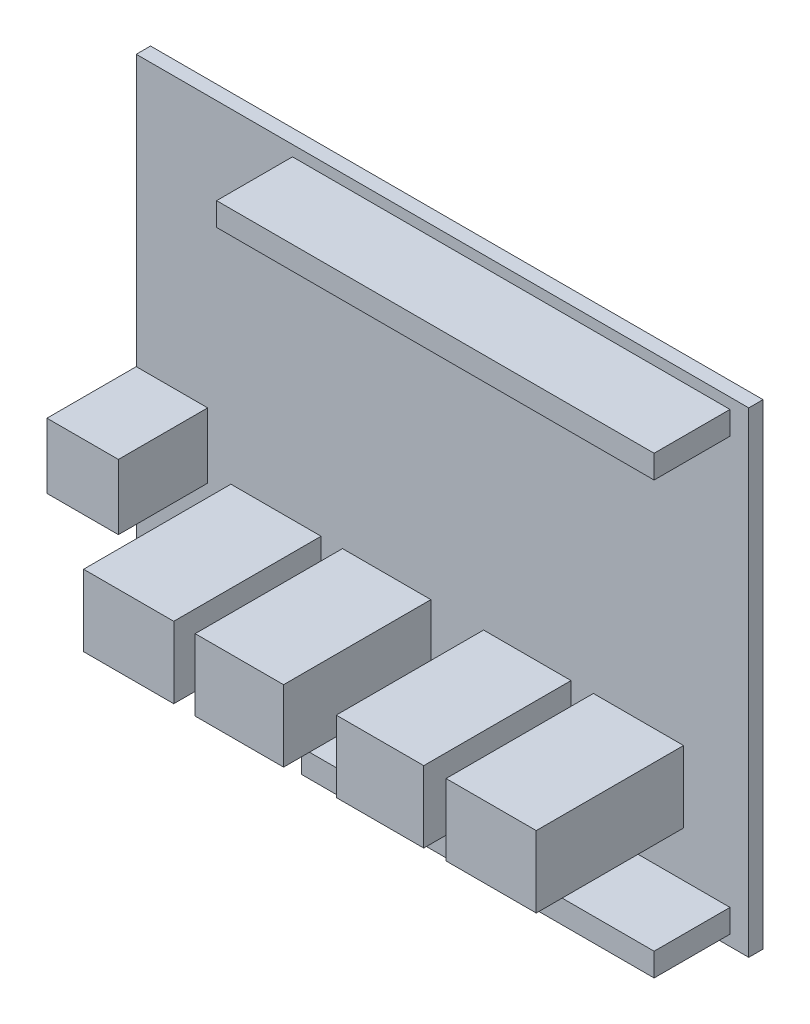
ISO-10303-21;
HEADER;
FILE_DESCRIPTION(('STEP AP214'),'2;1');
FILE_NAME('part.step','',(''),(''),'','','');
FILE_SCHEMA(('AUTOMOTIVE_DESIGN { 1 0 10303 214 1 1 1 1 }'));
ENDSEC;
DATA;
#1=APPLICATION_CONTEXT('core data for automotive mechanical design processes');
#2=APPLICATION_PROTOCOL_DEFINITION('international standard','automotive_design',2000,#1);
#3=PRODUCT_CONTEXT('',#1,'mechanical');
#4=PRODUCT('Part','Part','',(#3));
#5=PRODUCT_RELATED_PRODUCT_CATEGORY('part','',(#4));
#6=PRODUCT_DEFINITION_FORMATION('','',#4);
#7=PRODUCT_DEFINITION_CONTEXT('part definition',#1,'design');
#8=PRODUCT_DEFINITION('design','',#6,#7);
#9=PRODUCT_DEFINITION_SHAPE('','',#8);
#10=(LENGTH_UNIT() NAMED_UNIT(*) SI_UNIT(.MILLI.,.METRE.));
#11=(NAMED_UNIT(*) PLANE_ANGLE_UNIT() SI_UNIT($,.RADIAN.));
#12=(NAMED_UNIT(*) SI_UNIT($,.STERADIAN.) SOLID_ANGLE_UNIT());
#13=UNCERTAINTY_MEASURE_WITH_UNIT(LENGTH_MEASURE(1.E-05),#10,'distance_accuracy_value','');
#14=(GEOMETRIC_REPRESENTATION_CONTEXT(3) GLOBAL_UNCERTAINTY_ASSIGNED_CONTEXT((#13)) GLOBAL_UNIT_ASSIGNED_CONTEXT((#10,
#11,#12)) REPRESENTATION_CONTEXT('',''));
#15=CARTESIAN_POINT('',(0.,0.,0.));
#16=DIRECTION('',(0.,0.,1.));
#17=DIRECTION('',(1.,0.,0.));
#18=AXIS2_PLACEMENT_3D('',#15,#16,#17);
#19=CARTESIAN_POINT('',(0.,0.,1.6));
#20=DIRECTION('',(0.,0.,1.));
#21=DIRECTION('',(1.,0.,0.));
#22=AXIS2_PLACEMENT_3D('',#19,#20,#21);
#23=PLANE('',#22);
#24=DIRECTION('',(-1.,0.,0.));
#25=VECTOR('',#24,1.);
#26=CARTESIAN_POINT('',(0.,8.9,1.6));
#27=LINE('',#26,#25);
#28=CARTESIAN_POINT('',(61.3,8.9,1.60000000000001));
#29=VERTEX_POINT('',#28);
#30=CARTESIAN_POINT('',(51.2,8.9,1.60000000000001));
#31=VERTEX_POINT('',#30);
#32=EDGE_CURVE('E494',#29,#31,#27,.T.);
#33=ORIENTED_EDGE('',*,*,#32,.T.);
#34=DIRECTION('',(0.,1.,0.));
#35=VECTOR('',#34,1.);
#36=CARTESIAN_POINT('',(51.2,0.,1.6));
#37=LINE('',#36,#35);
#38=CARTESIAN_POINT('',(51.2,16.9,1.60000000000001));
#39=VERTEX_POINT('',#38);
#40=EDGE_CURVE('E496',#31,#39,#37,.T.);
#41=ORIENTED_EDGE('',*,*,#40,.T.);
#42=DIRECTION('',(1.,0.,0.));
#43=VECTOR('',#42,1.);
#44=CARTESIAN_POINT('',(0.,16.9,1.6));
#45=LINE('',#44,#43);
#46=CARTESIAN_POINT('',(61.3,16.9,1.6));
#47=VERTEX_POINT('',#46);
#48=EDGE_CURVE('E403',#39,#47,#45,.T.);
#49=ORIENTED_EDGE('',*,*,#48,.T.);
#50=DIRECTION('',(0.,-1.,0.));
#51=VECTOR('',#50,1.);
#52=CARTESIAN_POINT('',(61.3,0.,1.6));
#53=LINE('',#52,#51);
#54=EDGE_CURVE('E491',#47,#29,#53,.T.);
#55=ORIENTED_EDGE('',*,*,#54,.T.);
#56=EDGE_LOOP('',(#33,#41,#49,#55));
#57=FACE_BOUND('',#56,.T.);
#58=DIRECTION('',(-1.,0.,0.));
#59=VECTOR('',#58,1.);
#60=CARTESIAN_POINT('',(0.,8.9,1.6));
#61=LINE('',#60,#59);
#62=CARTESIAN_POINT('',(48.7,8.9,1.60000000000001));
#63=VERTEX_POINT('',#62);
#64=CARTESIAN_POINT('',(38.9,8.9,1.60000000000001));
#65=VERTEX_POINT('',#64);
#66=EDGE_CURVE('E512',#63,#65,#61,.T.);
#67=ORIENTED_EDGE('',*,*,#66,.T.);
#68=DIRECTION('',(0.,1.,0.));
#69=VECTOR('',#68,1.);
#70=CARTESIAN_POINT('',(38.9,0.,1.6));
#71=LINE('',#70,#69);
#72=CARTESIAN_POINT('',(38.9,16.9,1.60000000000001));
#73=VERTEX_POINT('',#72);
#74=EDGE_CURVE('E513',#65,#73,#71,.T.);
#75=ORIENTED_EDGE('',*,*,#74,.T.);
#76=DIRECTION('',(1.,0.,0.));
#77=VECTOR('',#76,1.);
#78=CARTESIAN_POINT('',(0.,16.9,1.6));
#79=LINE('',#78,#77);
#80=CARTESIAN_POINT('',(48.7,16.9,1.6));
#81=VERTEX_POINT('',#80);
#82=EDGE_CURVE('E504',#73,#81,#79,.T.);
#83=ORIENTED_EDGE('',*,*,#82,.T.);
#84=DIRECTION('',(0.,-1.,0.));
#85=VECTOR('',#84,1.);
#86=CARTESIAN_POINT('',(48.7,0.,1.6));
#87=LINE('',#86,#85);
#88=EDGE_CURVE('E510',#81,#63,#87,.T.);
#89=ORIENTED_EDGE('',*,*,#88,.T.);
#90=EDGE_LOOP('',(#67,#75,#83,#89));
#91=FACE_BOUND('',#90,.T.);
#92=DIRECTION('',(-1.,0.,0.));
#93=VECTOR('',#92,1.);
#94=CARTESIAN_POINT('',(0.,8.9,1.6));
#95=LINE('',#94,#93);
#96=CARTESIAN_POINT('',(33.,8.9,1.60000000000001));
#97=VERTEX_POINT('',#96);
#98=CARTESIAN_POINT('',(23.1,8.9,1.60000000000001));
#99=VERTEX_POINT('',#98);
#100=EDGE_CURVE('E527',#97,#99,#95,.T.);
#101=ORIENTED_EDGE('',*,*,#100,.T.);
#102=DIRECTION('',(0.,1.,0.));
#103=VECTOR('',#102,1.);
#104=CARTESIAN_POINT('',(23.1,0.,1.6));
#105=LINE('',#104,#103);
#106=CARTESIAN_POINT('',(23.1,16.9,1.60000000000001));
#107=VERTEX_POINT('',#106);
#108=EDGE_CURVE('E533',#99,#107,#105,.T.);
#109=ORIENTED_EDGE('',*,*,#108,.T.);
#110=DIRECTION('',(1.,0.,0.));
#111=VECTOR('',#110,1.);
#112=CARTESIAN_POINT('',(0.,16.9,1.6));
#113=LINE('',#112,#111);
#114=CARTESIAN_POINT('',(33.,16.9,1.6));
#115=VERTEX_POINT('',#114);
#116=EDGE_CURVE('E516',#107,#115,#113,.T.);
#117=ORIENTED_EDGE('',*,*,#116,.T.);
#118=DIRECTION('',(0.,-1.,0.));
#119=VECTOR('',#118,1.);
#120=CARTESIAN_POINT('',(33.,0.,1.6));
#121=LINE('',#120,#119);
#122=EDGE_CURVE('E521',#115,#97,#121,.T.);
#123=ORIENTED_EDGE('',*,*,#122,.T.);
#124=EDGE_LOOP('',(#101,#109,#117,#123));
#125=FACE_BOUND('',#124,.T.);
#126=DIRECTION('',(-1.,0.,0.));
#127=VECTOR('',#126,1.);
#128=CARTESIAN_POINT('',(0.,8.9,1.6));
#129=LINE('',#128,#127);
#130=CARTESIAN_POINT('',(20.7,8.9,1.60000000000001));
#131=VERTEX_POINT('',#130);
#132=CARTESIAN_POINT('',(10.6,8.9,1.60000000000001));
#133=VERTEX_POINT('',#132);
#134=EDGE_CURVE('E543',#131,#133,#129,.T.);
#135=ORIENTED_EDGE('',*,*,#134,.T.);
#136=DIRECTION('',(0.,1.,0.));
#137=VECTOR('',#136,1.);
#138=CARTESIAN_POINT('',(10.6,0.,1.6));
#139=LINE('',#138,#137);
#140=CARTESIAN_POINT('',(10.6,16.9,1.60000000000001));
#141=VERTEX_POINT('',#140);
#142=EDGE_CURVE('E550',#133,#141,#139,.T.);
#143=ORIENTED_EDGE('',*,*,#142,.T.);
#144=DIRECTION('',(1.,0.,0.));
#145=VECTOR('',#144,1.);
#146=CARTESIAN_POINT('',(0.,16.9,1.6));
#147=LINE('',#146,#145);
#148=CARTESIAN_POINT('',(20.7,16.9,1.6));
#149=VERTEX_POINT('',#148);
#150=EDGE_CURVE('E532',#141,#149,#147,.T.);
#151=ORIENTED_EDGE('',*,*,#150,.T.);
#152=DIRECTION('',(0.,-1.,0.));
#153=VECTOR('',#152,1.);
#154=CARTESIAN_POINT('',(20.7,0.,1.6));
#155=LINE('',#154,#153);
#156=EDGE_CURVE('E537',#149,#131,#155,.T.);
#157=ORIENTED_EDGE('',*,*,#156,.T.);
#158=EDGE_LOOP('',(#135,#143,#151,#157));
#159=FACE_BOUND('',#158,.T.);
#160=DIRECTION('',(0.,-1.,0.));
#161=VECTOR('',#160,1.);
#162=CARTESIAN_POINT('',(8.,0.,1.6));
#163=LINE('',#162,#161);
#164=CARTESIAN_POINT('',(8.,23.,1.6));
#165=VERTEX_POINT('',#164);
#166=CARTESIAN_POINT('',(8.,15.7,1.6));
#167=VERTEX_POINT('',#166);
#168=EDGE_CURVE('E371',#165,#167,#163,.T.);
#169=ORIENTED_EDGE('',*,*,#168,.T.);
#170=DIRECTION('',(-1.,0.,0.));
#171=VECTOR('',#170,1.);
#172=CARTESIAN_POINT('',(0.,15.7,1.6));
#173=LINE('',#172,#171);
#174=CARTESIAN_POINT('',(0.,15.7,1.6));
#175=VERTEX_POINT('',#174);
#176=EDGE_CURVE('E11',#167,#175,#173,.T.);
#177=ORIENTED_EDGE('',*,*,#176,.T.);
#178=DIRECTION('',(0.,-1.,0.));
#179=VECTOR('',#178,1.);
#180=CARTESIAN_POINT('',(0.,53.3,1.6));
#181=LINE('',#180,#179);
#182=CARTESIAN_POINT('',(0.,0.,1.6));
#183=VERTEX_POINT('',#182);
#184=EDGE_CURVE('E560',#175,#183,#181,.T.);
#185=ORIENTED_EDGE('',*,*,#184,.T.);
#186=DIRECTION('',(1.,0.,0.));
#187=VECTOR('',#186,1.);
#188=CARTESIAN_POINT('',(0.,0.,1.6));
#189=LINE('',#188,#187);
#190=CARTESIAN_POINT('',(68.6,0.,1.6));
#191=VERTEX_POINT('',#190);
#192=EDGE_CURVE('E557',#183,#191,#189,.T.);
#193=ORIENTED_EDGE('',*,*,#192,.T.);
#194=DIRECTION('',(0.,1.,0.));
#195=VECTOR('',#194,1.);
#196=CARTESIAN_POINT('',(68.6,0.,1.6));
#197=LINE('',#196,#195);
#198=CARTESIAN_POINT('',(68.6,53.3,1.6));
#199=VERTEX_POINT('',#198);
#200=EDGE_CURVE('E558',#191,#199,#197,.T.);
#201=ORIENTED_EDGE('',*,*,#200,.T.);
#202=DIRECTION('',(-1.,0.,0.));
#203=VECTOR('',#202,1.);
#204=CARTESIAN_POINT('',(68.6,53.3,1.6));
#205=LINE('',#204,#203);
#206=CARTESIAN_POINT('',(0.,53.3,1.6));
#207=VERTEX_POINT('',#206);
#208=EDGE_CURVE('E561',#199,#207,#205,.T.);
#209=ORIENTED_EDGE('',*,*,#208,.T.);
#210=CARTESIAN_POINT('',(0.,23.,1.6));
#211=VERTEX_POINT('',#210);
#212=EDGE_CURVE('E555',#207,#211,#181,.T.);
#213=ORIENTED_EDGE('',*,*,#212,.T.);
#214=DIRECTION('',(1.,0.,0.));
#215=VECTOR('',#214,1.);
#216=CARTESIAN_POINT('',(0.,23.,1.6));
#217=LINE('',#216,#215);
#218=EDGE_CURVE('E53',#211,#165,#217,.T.);
#219=ORIENTED_EDGE('',*,*,#218,.T.);
#220=EDGE_LOOP('',(#169,#177,#185,#193,#201,#209,#213,#219));
#221=FACE_BOUND('',#220,.T.);
#222=DIRECTION('',(-1.,0.,0.));
#223=VECTOR('',#222,1.);
#224=CARTESIAN_POINT('',(0.,1.2,1.6));
#225=LINE('',#224,#223);
#226=CARTESIAN_POINT('',(66.5,1.2,1.6));
#227=VERTEX_POINT('',#226);
#228=CARTESIAN_POINT('',(27.,1.2,1.6));
#229=VERTEX_POINT('',#228);
#230=EDGE_CURVE('E323',#227,#229,#225,.T.);
#231=ORIENTED_EDGE('',*,*,#230,.T.);
#232=DIRECTION('',(0.,1.,0.));
#233=VECTOR('',#232,1.);
#234=CARTESIAN_POINT('',(27.,0.,1.6));
#235=LINE('',#234,#233);
#236=CARTESIAN_POINT('',(27.,3.8,1.6));
#237=VERTEX_POINT('',#236);
#238=EDGE_CURVE('E330',#229,#237,#235,.T.);
#239=ORIENTED_EDGE('',*,*,#238,.T.);
#240=DIRECTION('',(1.,0.,0.));
#241=VECTOR('',#240,1.);
#242=CARTESIAN_POINT('',(0.,3.8,1.6));
#243=LINE('',#242,#241);
#244=CARTESIAN_POINT('',(66.5,3.8,1.6));
#245=VERTEX_POINT('',#244);
#246=EDGE_CURVE('E281',#237,#245,#243,.T.);
#247=ORIENTED_EDGE('',*,*,#246,.T.);
#248=DIRECTION('',(0.,-1.,0.));
#249=VECTOR('',#248,1.);
#250=CARTESIAN_POINT('',(66.5,0.,1.6));
#251=LINE('',#250,#249);
#252=EDGE_CURVE('E289',#245,#227,#251,.T.);
#253=ORIENTED_EDGE('',*,*,#252,.T.);
#254=EDGE_LOOP('',(#231,#239,#247,#253));
#255=FACE_BOUND('',#254,.T.);
#256=DIRECTION('',(-1.,0.,0.));
#257=VECTOR('',#256,1.);
#258=CARTESIAN_POINT('',(0.,49.5,1.6));
#259=LINE('',#258,#257);
#260=CARTESIAN_POINT('',(66.5,49.5,1.6));
#261=VERTEX_POINT('',#260);
#262=CARTESIAN_POINT('',(17.5,49.5,1.6));
#263=VERTEX_POINT('',#262);
#264=EDGE_CURVE('E336',#261,#263,#259,.T.);
#265=ORIENTED_EDGE('',*,*,#264,.T.);
#266=DIRECTION('',(0.,1.,0.));
#267=VECTOR('',#266,1.);
#268=CARTESIAN_POINT('',(17.5,0.,1.6));
#269=LINE('',#268,#267);
#270=CARTESIAN_POINT('',(17.5,52.1,1.6));
#271=VERTEX_POINT('',#270);
#272=EDGE_CURVE('E285',#263,#271,#269,.T.);
#273=ORIENTED_EDGE('',*,*,#272,.T.);
#274=DIRECTION('',(1.,0.,0.));
#275=VECTOR('',#274,1.);
#276=CARTESIAN_POINT('',(0.,52.1,1.6));
#277=LINE('',#276,#275);
#278=CARTESIAN_POINT('',(66.5,52.1,1.6));
#279=VERTEX_POINT('',#278);
#280=EDGE_CURVE('E332',#271,#279,#277,.T.);
#281=ORIENTED_EDGE('',*,*,#280,.T.);
#282=DIRECTION('',(0.,-1.,0.));
#283=VECTOR('',#282,1.);
#284=CARTESIAN_POINT('',(66.5,0.,1.6));
#285=LINE('',#284,#283);
#286=EDGE_CURVE('E333',#279,#261,#285,.T.);
#287=ORIENTED_EDGE('',*,*,#286,.T.);
#288=EDGE_LOOP('',(#265,#273,#281,#287));
#289=FACE_BOUND('',#288,.T.);
#290=ADVANCED_FACE('F44',(#57,#91,#125,#159,#221,#255,#289),#23,.T.);
#291=CARTESIAN_POINT('',(0.,53.3,1.6));
#292=DIRECTION('',(1.,0.,0.));
#293=DIRECTION('',(0.,0.,-1.));
#294=AXIS2_PLACEMENT_3D('',#291,#292,#293);
#295=PLANE('',#294);
#296=ORIENTED_EDGE('',*,*,#184,.F.);
#297=DIRECTION('',(0.,0.,-1.));
#298=VECTOR('',#297,1.);
#299=CARTESIAN_POINT('',(0.,15.7,11.6));
#300=LINE('',#299,#298);
#301=CARTESIAN_POINT('',(0.,15.7,11.6));
#302=VERTEX_POINT('',#301);
#303=EDGE_CURVE('E366',#302,#175,#300,.T.);
#304=ORIENTED_EDGE('',*,*,#303,.F.);
#305=DIRECTION('',(0.,-1.,0.));
#306=VECTOR('',#305,1.);
#307=CARTESIAN_POINT('',(0.,23.,11.6));
#308=LINE('',#307,#306);
#309=CARTESIAN_POINT('',(0.,23.,11.6));
#310=VERTEX_POINT('',#309);
#311=EDGE_CURVE('E344',#310,#302,#308,.T.);
#312=ORIENTED_EDGE('',*,*,#311,.F.);
#313=DIRECTION('',(0.,0.,-1.));
#314=VECTOR('',#313,1.);
#315=CARTESIAN_POINT('',(0.,23.,11.6));
#316=LINE('',#315,#314);
#317=EDGE_CURVE('E360',#310,#211,#316,.T.);
#318=ORIENTED_EDGE('',*,*,#317,.T.);
#319=ORIENTED_EDGE('',*,*,#212,.F.);
#320=DIRECTION('',(0.,0.,-1.));
#321=VECTOR('',#320,1.);
#322=CARTESIAN_POINT('',(0.,53.3,1.6));
#323=LINE('',#322,#321);
#324=CARTESIAN_POINT('',(0.,53.3,0.));
#325=VERTEX_POINT('',#324);
#326=EDGE_CURVE('E567',#207,#325,#323,.T.);
#327=ORIENTED_EDGE('',*,*,#326,.T.);
#328=DIRECTION('',(0.,-1.,0.));
#329=VECTOR('',#328,1.);
#330=CARTESIAN_POINT('',(0.,53.3,0.));
#331=LINE('',#330,#329);
#332=CARTESIAN_POINT('',(0.,0.,0.));
#333=VERTEX_POINT('',#332);
#334=EDGE_CURVE('E552',#325,#333,#331,.T.);
#335=ORIENTED_EDGE('',*,*,#334,.T.);
#336=DIRECTION('',(0.,0.,-1.));
#337=VECTOR('',#336,1.);
#338=CARTESIAN_POINT('',(0.,0.,1.6));
#339=LINE('',#338,#337);
#340=EDGE_CURVE('E589',#183,#333,#339,.T.);
#341=ORIENTED_EDGE('',*,*,#340,.F.);
#342=EDGE_LOOP('',(#296,#304,#312,#318,#319,#327,#335,#341));
#343=FACE_BOUND('',#342,.T.);
#344=ADVANCED_FACE('F50',(#343),#295,.F.);
#345=CARTESIAN_POINT('',(0.,0.,1.6));
#346=DIRECTION('',(0.,1.,0.));
#347=DIRECTION('',(0.,0.,1.));
#348=AXIS2_PLACEMENT_3D('',#345,#346,#347);
#349=PLANE('',#348);
#350=DIRECTION('',(1.,0.,0.));
#351=VECTOR('',#350,1.);
#352=CARTESIAN_POINT('',(0.,0.,0.));
#353=LINE('',#352,#351);
#354=CARTESIAN_POINT('',(68.6,0.,0.));
#355=VERTEX_POINT('',#354);
#356=EDGE_CURVE('E569',#333,#355,#353,.T.);
#357=ORIENTED_EDGE('',*,*,#356,.T.);
#358=DIRECTION('',(0.,0.,-1.));
#359=VECTOR('',#358,1.);
#360=CARTESIAN_POINT('',(68.6,0.,1.6));
#361=LINE('',#360,#359);
#362=EDGE_CURVE('E584',#191,#355,#361,.T.);
#363=ORIENTED_EDGE('',*,*,#362,.F.);
#364=ORIENTED_EDGE('',*,*,#192,.F.);
#365=ORIENTED_EDGE('',*,*,#340,.T.);
#366=EDGE_LOOP('',(#357,#363,#364,#365));
#367=FACE_BOUND('',#366,.T.);
#368=ADVANCED_FACE('F622',(#367),#349,.F.);
#369=CARTESIAN_POINT('',(68.6,0.,1.6));
#370=DIRECTION('',(-1.,0.,0.));
#371=DIRECTION('',(0.,0.,1.));
#372=AXIS2_PLACEMENT_3D('',#369,#370,#371);
#373=PLANE('',#372);
#374=DIRECTION('',(0.,1.,0.));
#375=VECTOR('',#374,1.);
#376=CARTESIAN_POINT('',(68.6,0.,0.));
#377=LINE('',#376,#375);
#378=CARTESIAN_POINT('',(68.6,53.3,0.));
#379=VERTEX_POINT('',#378);
#380=EDGE_CURVE('E575',#355,#379,#377,.T.);
#381=ORIENTED_EDGE('',*,*,#380,.T.);
#382=DIRECTION('',(0.,0.,-1.));
#383=VECTOR('',#382,1.);
#384=CARTESIAN_POINT('',(68.6,53.3,1.6));
#385=LINE('',#384,#383);
#386=EDGE_CURVE('E583',#199,#379,#385,.T.);
#387=ORIENTED_EDGE('',*,*,#386,.F.);
#388=ORIENTED_EDGE('',*,*,#200,.F.);
#389=ORIENTED_EDGE('',*,*,#362,.T.);
#390=EDGE_LOOP('',(#381,#387,#388,#389));
#391=FACE_BOUND('',#390,.T.);
#392=ADVANCED_FACE('F629',(#391),#373,.F.);
#393=CARTESIAN_POINT('',(68.6,53.3,1.6));
#394=DIRECTION('',(0.,-1.,0.));
#395=DIRECTION('',(0.,0.,-1.));
#396=AXIS2_PLACEMENT_3D('',#393,#394,#395);
#397=PLANE('',#396);
#398=DIRECTION('',(-1.,0.,0.));
#399=VECTOR('',#398,1.);
#400=CARTESIAN_POINT('',(68.6,53.3,0.));
#401=LINE('',#400,#399);
#402=EDGE_CURVE('E573',#379,#325,#401,.T.);
#403=ORIENTED_EDGE('',*,*,#402,.T.);
#404=ORIENTED_EDGE('',*,*,#326,.F.);
#405=ORIENTED_EDGE('',*,*,#208,.F.);
#406=ORIENTED_EDGE('',*,*,#386,.T.);
#407=EDGE_LOOP('',(#403,#404,#405,#406));
#408=FACE_BOUND('',#407,.T.);
#409=ADVANCED_FACE('F635',(#408),#397,.F.);
#410=CARTESIAN_POINT('',(0.,0.,0.));
#411=DIRECTION('',(0.,0.,1.));
#412=DIRECTION('',(1.,0.,0.));
#413=AXIS2_PLACEMENT_3D('',#410,#411,#412);
#414=PLANE('',#413);
#415=ORIENTED_EDGE('',*,*,#356,.F.);
#416=ORIENTED_EDGE('',*,*,#334,.F.);
#417=ORIENTED_EDGE('',*,*,#402,.F.);
#418=ORIENTED_EDGE('',*,*,#380,.F.);
#419=EDGE_LOOP('',(#415,#416,#417,#418));
#420=FACE_BOUND('',#419,.T.);
#421=ADVANCED_FACE('F634',(#420),#414,.F.);
#422=CARTESIAN_POINT('',(51.2,16.9,18.1));
#423=DIRECTION('',(1.,0.,0.));
#424=DIRECTION('',(0.,0.,-1.));
#425=AXIS2_PLACEMENT_3D('',#422,#423,#424);
#426=PLANE('',#425);
#427=ORIENTED_EDGE('',*,*,#40,.F.);
#428=DIRECTION('',(0.,0.,-1.));
#429=VECTOR('',#428,1.);
#430=CARTESIAN_POINT('',(51.2,8.9,18.1));
#431=LINE('',#430,#429);
#432=CARTESIAN_POINT('',(51.2,8.9,18.1));
#433=VERTEX_POINT('',#432);
#434=EDGE_CURVE('E374',#433,#31,#431,.T.);
#435=ORIENTED_EDGE('',*,*,#434,.F.);
#436=DIRECTION('',(0.,-1.,0.));
#437=VECTOR('',#436,1.);
#438=CARTESIAN_POINT('',(51.2,16.9,18.1));
#439=LINE('',#438,#437);
#440=CARTESIAN_POINT('',(51.2,16.9,18.1));
#441=VERTEX_POINT('',#440);
#442=EDGE_CURVE('E438',#441,#433,#439,.T.);
#443=ORIENTED_EDGE('',*,*,#442,.F.);
#444=DIRECTION('',(0.,0.,-1.));
#445=VECTOR('',#444,1.);
#446=CARTESIAN_POINT('',(51.2,16.9,18.1));
#447=LINE('',#446,#445);
#448=EDGE_CURVE('E472',#441,#39,#447,.T.);
#449=ORIENTED_EDGE('',*,*,#448,.T.);
#450=EDGE_LOOP('',(#427,#435,#443,#449));
#451=FACE_BOUND('',#450,.T.);
#452=ADVANCED_FACE('F638',(#451),#426,.F.);
#453=CARTESIAN_POINT('',(51.2,8.9,18.1));
#454=DIRECTION('',(0.,1.,0.));
#455=DIRECTION('',(0.,0.,1.));
#456=AXIS2_PLACEMENT_3D('',#453,#454,#455);
#457=PLANE('',#456);
#458=ORIENTED_EDGE('',*,*,#32,.F.);
#459=DIRECTION('',(0.,0.,-1.));
#460=VECTOR('',#459,1.);
#461=CARTESIAN_POINT('',(61.3,8.9,18.1));
#462=LINE('',#461,#460);
#463=CARTESIAN_POINT('',(61.3,8.9,18.1));
#464=VERTEX_POINT('',#463);
#465=EDGE_CURVE('E463',#464,#29,#462,.T.);
#466=ORIENTED_EDGE('',*,*,#465,.F.);
#467=DIRECTION('',(1.,0.,0.));
#468=VECTOR('',#467,1.);
#469=CARTESIAN_POINT('',(51.2,8.9,18.1));
#470=LINE('',#469,#468);
#471=EDGE_CURVE('E485',#433,#464,#470,.T.);
#472=ORIENTED_EDGE('',*,*,#471,.F.);
#473=ORIENTED_EDGE('',*,*,#434,.T.);
#474=EDGE_LOOP('',(#458,#466,#472,#473));
#475=FACE_BOUND('',#474,.T.);
#476=ADVANCED_FACE('F641',(#475),#457,.F.);
#477=CARTESIAN_POINT('',(61.3,8.9,18.1));
#478=DIRECTION('',(-1.,0.,0.));
#479=DIRECTION('',(0.,0.,1.));
#480=AXIS2_PLACEMENT_3D('',#477,#478,#479);
#481=PLANE('',#480);
#482=ORIENTED_EDGE('',*,*,#54,.F.);
#483=DIRECTION('',(0.,0.,-1.));
#484=VECTOR('',#483,1.);
#485=CARTESIAN_POINT('',(61.3,16.9,18.1));
#486=LINE('',#485,#484);
#487=CARTESIAN_POINT('',(61.3,16.9,18.1));
#488=VERTEX_POINT('',#487);
#489=EDGE_CURVE('E469',#488,#47,#486,.T.);
#490=ORIENTED_EDGE('',*,*,#489,.F.);
#491=DIRECTION('',(0.,1.,0.));
#492=VECTOR('',#491,1.);
#493=CARTESIAN_POINT('',(61.3,8.9,18.1));
#494=LINE('',#493,#492);
#495=EDGE_CURVE('E479',#464,#488,#494,.T.);
#496=ORIENTED_EDGE('',*,*,#495,.F.);
#497=ORIENTED_EDGE('',*,*,#465,.T.);
#498=EDGE_LOOP('',(#482,#490,#496,#497));
#499=FACE_BOUND('',#498,.T.);
#500=ADVANCED_FACE('F661',(#499),#481,.F.);
#501=CARTESIAN_POINT('',(61.3,16.9,18.1));
#502=DIRECTION('',(0.,-1.,0.));
#503=DIRECTION('',(0.,0.,-1.));
#504=AXIS2_PLACEMENT_3D('',#501,#502,#503);
#505=PLANE('',#504);
#506=ORIENTED_EDGE('',*,*,#48,.F.);
#507=ORIENTED_EDGE('',*,*,#448,.F.);
#508=DIRECTION('',(-1.,0.,0.));
#509=VECTOR('',#508,1.);
#510=CARTESIAN_POINT('',(61.3,16.9,18.1));
#511=LINE('',#510,#509);
#512=EDGE_CURVE('E478',#488,#441,#511,.T.);
#513=ORIENTED_EDGE('',*,*,#512,.F.);
#514=ORIENTED_EDGE('',*,*,#489,.T.);
#515=EDGE_LOOP('',(#506,#507,#513,#514));
#516=FACE_BOUND('',#515,.T.);
#517=ADVANCED_FACE('F659',(#516),#505,.F.);
#518=CARTESIAN_POINT('',(0.,0.,18.1));
#519=DIRECTION('',(0.,0.,1.));
#520=DIRECTION('',(1.,0.,0.));
#521=AXIS2_PLACEMENT_3D('',#518,#519,#520);
#522=PLANE('',#521);
#523=ORIENTED_EDGE('',*,*,#442,.T.);
#524=ORIENTED_EDGE('',*,*,#471,.T.);
#525=ORIENTED_EDGE('',*,*,#495,.T.);
#526=ORIENTED_EDGE('',*,*,#512,.T.);
#527=EDGE_LOOP('',(#523,#524,#525,#526));
#528=FACE_BOUND('',#527,.T.);
#529=ADVANCED_FACE('F656',(#528),#522,.T.);
#530=CARTESIAN_POINT('',(38.9,16.9,18.1));
#531=DIRECTION('',(1.,0.,0.));
#532=DIRECTION('',(0.,0.,-1.));
#533=AXIS2_PLACEMENT_3D('',#530,#531,#532);
#534=PLANE('',#533);
#535=ORIENTED_EDGE('',*,*,#74,.F.);
#536=DIRECTION('',(0.,0.,-1.));
#537=VECTOR('',#536,1.);
#538=CARTESIAN_POINT('',(38.9,8.9,18.1));
#539=LINE('',#538,#537);
#540=CARTESIAN_POINT('',(38.9,8.9,18.1));
#541=VERTEX_POINT('',#540);
#542=EDGE_CURVE('E432',#541,#65,#539,.T.);
#543=ORIENTED_EDGE('',*,*,#542,.F.);
#544=DIRECTION('',(0.,-1.,0.));
#545=VECTOR('',#544,1.);
#546=CARTESIAN_POINT('',(38.9,16.9,18.1));
#547=LINE('',#546,#545);
#548=CARTESIAN_POINT('',(38.9,16.9,18.1));
#549=VERTEX_POINT('',#548);
#550=EDGE_CURVE('E413',#549,#541,#547,.T.);
#551=ORIENTED_EDGE('',*,*,#550,.F.);
#552=DIRECTION('',(0.,0.,-1.));
#553=VECTOR('',#552,1.);
#554=CARTESIAN_POINT('',(38.9,16.9,18.1));
#555=LINE('',#554,#553);
#556=EDGE_CURVE('E447',#549,#73,#555,.T.);
#557=ORIENTED_EDGE('',*,*,#556,.T.);
#558=EDGE_LOOP('',(#535,#543,#551,#557));
#559=FACE_BOUND('',#558,.T.);
#560=ADVANCED_FACE('F658',(#559),#534,.F.);
#561=CARTESIAN_POINT('',(38.9,8.9,18.1));
#562=DIRECTION('',(0.,1.,0.));
#563=DIRECTION('',(0.,0.,1.));
#564=AXIS2_PLACEMENT_3D('',#561,#562,#563);
#565=PLANE('',#564);
#566=ORIENTED_EDGE('',*,*,#66,.F.);
#567=DIRECTION('',(0.,0.,-1.));
#568=VECTOR('',#567,1.);
#569=CARTESIAN_POINT('',(48.7,8.9,18.1));
#570=LINE('',#569,#568);
#571=CARTESIAN_POINT('',(48.7,8.9,18.1));
#572=VERTEX_POINT('',#571);
#573=EDGE_CURVE('E437',#572,#63,#570,.T.);
#574=ORIENTED_EDGE('',*,*,#573,.F.);
#575=DIRECTION('',(1.,0.,0.));
#576=VECTOR('',#575,1.);
#577=CARTESIAN_POINT('',(38.9,8.9,18.1));
#578=LINE('',#577,#576);
#579=EDGE_CURVE('E457',#541,#572,#578,.T.);
#580=ORIENTED_EDGE('',*,*,#579,.F.);
#581=ORIENTED_EDGE('',*,*,#542,.T.);
#582=EDGE_LOOP('',(#566,#574,#580,#581));
#583=FACE_BOUND('',#582,.T.);
#584=ADVANCED_FACE('F681',(#583),#565,.F.);
#585=CARTESIAN_POINT('',(48.7,8.9,18.1));
#586=DIRECTION('',(-1.,0.,0.));
#587=DIRECTION('',(0.,0.,1.));
#588=AXIS2_PLACEMENT_3D('',#585,#586,#587);
#589=PLANE('',#588);
#590=ORIENTED_EDGE('',*,*,#88,.F.);
#591=DIRECTION('',(0.,0.,-1.));
#592=VECTOR('',#591,1.);
#593=CARTESIAN_POINT('',(48.7,16.9,18.1));
#594=LINE('',#593,#592);
#595=CARTESIAN_POINT('',(48.7,16.9,18.1));
#596=VERTEX_POINT('',#595);
#597=EDGE_CURVE('E444',#596,#81,#594,.T.);
#598=ORIENTED_EDGE('',*,*,#597,.F.);
#599=DIRECTION('',(0.,1.,0.));
#600=VECTOR('',#599,1.);
#601=CARTESIAN_POINT('',(48.7,8.9,18.1));
#602=LINE('',#601,#600);
#603=EDGE_CURVE('E451',#572,#596,#602,.T.);
#604=ORIENTED_EDGE('',*,*,#603,.F.);
#605=ORIENTED_EDGE('',*,*,#573,.T.);
#606=EDGE_LOOP('',(#590,#598,#604,#605));
#607=FACE_BOUND('',#606,.T.);
#608=ADVANCED_FACE('F678',(#607),#589,.F.);
#609=CARTESIAN_POINT('',(48.7,16.9,18.1));
#610=DIRECTION('',(0.,-1.,0.));
#611=DIRECTION('',(0.,0.,-1.));
#612=AXIS2_PLACEMENT_3D('',#609,#610,#611);
#613=PLANE('',#612);
#614=ORIENTED_EDGE('',*,*,#82,.F.);
#615=ORIENTED_EDGE('',*,*,#556,.F.);
#616=DIRECTION('',(-1.,0.,0.));
#617=VECTOR('',#616,1.);
#618=CARTESIAN_POINT('',(48.7,16.9,18.1));
#619=LINE('',#618,#617);
#620=EDGE_CURVE('E448',#596,#549,#619,.T.);
#621=ORIENTED_EDGE('',*,*,#620,.F.);
#622=ORIENTED_EDGE('',*,*,#597,.T.);
#623=EDGE_LOOP('',(#614,#615,#621,#622));
#624=FACE_BOUND('',#623,.T.);
#625=ADVANCED_FACE('F677',(#624),#613,.F.);
#626=CARTESIAN_POINT('',(0.,0.,18.1));
#627=DIRECTION('',(0.,0.,1.));
#628=DIRECTION('',(1.,0.,0.));
#629=AXIS2_PLACEMENT_3D('',#626,#627,#628);
#630=PLANE('',#629);
#631=ORIENTED_EDGE('',*,*,#550,.T.);
#632=ORIENTED_EDGE('',*,*,#579,.T.);
#633=ORIENTED_EDGE('',*,*,#603,.T.);
#634=ORIENTED_EDGE('',*,*,#620,.T.);
#635=EDGE_LOOP('',(#631,#632,#633,#634));
#636=FACE_BOUND('',#635,.T.);
#637=ADVANCED_FACE('F675',(#636),#630,.T.);
#638=CARTESIAN_POINT('',(23.1,16.9,18.1));
#639=DIRECTION('',(1.,0.,0.));
#640=DIRECTION('',(0.,0.,-1.));
#641=AXIS2_PLACEMENT_3D('',#638,#639,#640);
#642=PLANE('',#641);
#643=ORIENTED_EDGE('',*,*,#108,.F.);
#644=DIRECTION('',(0.,0.,-1.));
#645=VECTOR('',#644,1.);
#646=CARTESIAN_POINT('',(23.1,8.9,18.1));
#647=LINE('',#646,#645);
#648=CARTESIAN_POINT('',(23.1,8.9,18.1));
#649=VERTEX_POINT('',#648);
#650=EDGE_CURVE('E407',#649,#99,#647,.T.);
#651=ORIENTED_EDGE('',*,*,#650,.F.);
#652=DIRECTION('',(0.,-1.,0.));
#653=VECTOR('',#652,1.);
#654=CARTESIAN_POINT('',(23.1,16.9,18.1));
#655=LINE('',#654,#653);
#656=CARTESIAN_POINT('',(23.1,16.9,18.1));
#657=VERTEX_POINT('',#656);
#658=EDGE_CURVE('E381',#657,#649,#655,.T.);
#659=ORIENTED_EDGE('',*,*,#658,.F.);
#660=DIRECTION('',(0.,0.,-1.));
#661=VECTOR('',#660,1.);
#662=CARTESIAN_POINT('',(23.1,16.9,18.1));
#663=LINE('',#662,#661);
#664=EDGE_CURVE('E416',#657,#107,#663,.T.);
#665=ORIENTED_EDGE('',*,*,#664,.T.);
#666=EDGE_LOOP('',(#643,#651,#659,#665));
#667=FACE_BOUND('',#666,.T.);
#668=ADVANCED_FACE('F672',(#667),#642,.F.);
#669=CARTESIAN_POINT('',(23.1,8.9,18.1));
#670=DIRECTION('',(0.,1.,0.));
#671=DIRECTION('',(0.,0.,1.));
#672=AXIS2_PLACEMENT_3D('',#669,#670,#671);
#673=PLANE('',#672);
#674=ORIENTED_EDGE('',*,*,#100,.F.);
#675=DIRECTION('',(0.,0.,-1.));
#676=VECTOR('',#675,1.);
#677=CARTESIAN_POINT('',(33.,8.9,18.1));
#678=LINE('',#677,#676);
#679=CARTESIAN_POINT('',(33.,8.9,18.1));
#680=VERTEX_POINT('',#679);
#681=EDGE_CURVE('E408',#680,#97,#678,.T.);
#682=ORIENTED_EDGE('',*,*,#681,.F.);
#683=DIRECTION('',(1.,0.,0.));
#684=VECTOR('',#683,1.);
#685=CARTESIAN_POINT('',(23.1,8.9,18.1));
#686=LINE('',#685,#684);
#687=EDGE_CURVE('E428',#649,#680,#686,.T.);
#688=ORIENTED_EDGE('',*,*,#687,.F.);
#689=ORIENTED_EDGE('',*,*,#650,.T.);
#690=EDGE_LOOP('',(#674,#682,#688,#689));
#691=FACE_BOUND('',#690,.T.);
#692=ADVANCED_FACE('F702',(#691),#673,.F.);
#693=CARTESIAN_POINT('',(33.,8.9,18.1));
#694=DIRECTION('',(-1.,0.,0.));
#695=DIRECTION('',(0.,0.,1.));
#696=AXIS2_PLACEMENT_3D('',#693,#694,#695);
#697=PLANE('',#696);
#698=ORIENTED_EDGE('',*,*,#122,.F.);
#699=DIRECTION('',(0.,0.,-1.));
#700=VECTOR('',#699,1.);
#701=CARTESIAN_POINT('',(33.,16.9,18.1));
#702=LINE('',#701,#700);
#703=CARTESIAN_POINT('',(33.,16.9,18.1));
#704=VERTEX_POINT('',#703);
#705=EDGE_CURVE('E412',#704,#115,#702,.T.);
#706=ORIENTED_EDGE('',*,*,#705,.F.);
#707=DIRECTION('',(0.,1.,0.));
#708=VECTOR('',#707,1.);
#709=CARTESIAN_POINT('',(33.,8.9,18.1));
#710=LINE('',#709,#708);
#711=EDGE_CURVE('E422',#680,#704,#710,.T.);
#712=ORIENTED_EDGE('',*,*,#711,.F.);
#713=ORIENTED_EDGE('',*,*,#681,.T.);
#714=EDGE_LOOP('',(#698,#706,#712,#713));
#715=FACE_BOUND('',#714,.T.);
#716=ADVANCED_FACE('F697',(#715),#697,.F.);
#717=CARTESIAN_POINT('',(33.,16.9,18.1));
#718=DIRECTION('',(0.,-1.,0.));
#719=DIRECTION('',(0.,0.,-1.));
#720=AXIS2_PLACEMENT_3D('',#717,#718,#719);
#721=PLANE('',#720);
#722=ORIENTED_EDGE('',*,*,#116,.F.);
#723=ORIENTED_EDGE('',*,*,#664,.F.);
#724=DIRECTION('',(-1.,0.,0.));
#725=VECTOR('',#724,1.);
#726=CARTESIAN_POINT('',(33.,16.9,18.1));
#727=LINE('',#726,#725);
#728=EDGE_CURVE('E425',#704,#657,#727,.T.);
#729=ORIENTED_EDGE('',*,*,#728,.F.);
#730=ORIENTED_EDGE('',*,*,#705,.T.);
#731=EDGE_LOOP('',(#722,#723,#729,#730));
#732=FACE_BOUND('',#731,.T.);
#733=ADVANCED_FACE('F698',(#732),#721,.F.);
#734=CARTESIAN_POINT('',(0.,0.,18.1));
#735=DIRECTION('',(0.,0.,1.));
#736=DIRECTION('',(1.,0.,0.));
#737=AXIS2_PLACEMENT_3D('',#734,#735,#736);
#738=PLANE('',#737);
#739=ORIENTED_EDGE('',*,*,#658,.T.);
#740=ORIENTED_EDGE('',*,*,#687,.T.);
#741=ORIENTED_EDGE('',*,*,#711,.T.);
#742=ORIENTED_EDGE('',*,*,#728,.T.);
#743=EDGE_LOOP('',(#739,#740,#741,#742));
#744=FACE_BOUND('',#743,.T.);
#745=ADVANCED_FACE('F692',(#744),#738,.T.);
#746=CARTESIAN_POINT('',(10.6,16.9,18.1));
#747=DIRECTION('',(1.,0.,0.));
#748=DIRECTION('',(0.,0.,-1.));
#749=AXIS2_PLACEMENT_3D('',#746,#747,#748);
#750=PLANE('',#749);
#751=ORIENTED_EDGE('',*,*,#142,.F.);
#752=DIRECTION('',(0.,0.,-1.));
#753=VECTOR('',#752,1.);
#754=CARTESIAN_POINT('',(10.6,8.9,18.1));
#755=LINE('',#754,#753);
#756=CARTESIAN_POINT('',(10.6,8.9,18.1));
#757=VERTEX_POINT('',#756);
#758=EDGE_CURVE('E402',#757,#133,#755,.T.);
#759=ORIENTED_EDGE('',*,*,#758,.F.);
#760=DIRECTION('',(0.,-1.,0.));
#761=VECTOR('',#760,1.);
#762=CARTESIAN_POINT('',(10.6,16.9,18.1));
#763=LINE('',#762,#761);
#764=CARTESIAN_POINT('',(10.6,16.9,18.1));
#765=VERTEX_POINT('',#764);
#766=EDGE_CURVE('E376',#765,#757,#763,.T.);
#767=ORIENTED_EDGE('',*,*,#766,.F.);
#768=DIRECTION('',(0.,0.,-1.));
#769=VECTOR('',#768,1.);
#770=CARTESIAN_POINT('',(10.6,16.9,18.1));
#771=LINE('',#770,#769);
#772=EDGE_CURVE('E388',#765,#141,#771,.T.);
#773=ORIENTED_EDGE('',*,*,#772,.T.);
#774=EDGE_LOOP('',(#751,#759,#767,#773));
#775=FACE_BOUND('',#774,.T.);
#776=ADVANCED_FACE('F694',(#775),#750,.F.);
#777=CARTESIAN_POINT('',(10.6,8.9,18.1));
#778=DIRECTION('',(0.,1.,0.));
#779=DIRECTION('',(0.,0.,1.));
#780=AXIS2_PLACEMENT_3D('',#777,#778,#779);
#781=PLANE('',#780);
#782=ORIENTED_EDGE('',*,*,#134,.F.);
#783=DIRECTION('',(0.,0.,-1.));
#784=VECTOR('',#783,1.);
#785=CARTESIAN_POINT('',(20.7,8.9,18.1));
#786=LINE('',#785,#784);
#787=CARTESIAN_POINT('',(20.7,8.9,18.1));
#788=VERTEX_POINT('',#787);
#789=EDGE_CURVE('E400',#788,#131,#786,.T.);
#790=ORIENTED_EDGE('',*,*,#789,.F.);
#791=DIRECTION('',(1.,0.,0.));
#792=VECTOR('',#791,1.);
#793=CARTESIAN_POINT('',(10.6,8.9,18.1));
#794=LINE('',#793,#792);
#795=EDGE_CURVE('E379',#757,#788,#794,.T.);
#796=ORIENTED_EDGE('',*,*,#795,.F.);
#797=ORIENTED_EDGE('',*,*,#758,.T.);
#798=EDGE_LOOP('',(#782,#790,#796,#797));
#799=FACE_BOUND('',#798,.T.);
#800=ADVANCED_FACE('F713',(#799),#781,.F.);
#801=CARTESIAN_POINT('',(20.7,8.9,18.1));
#802=DIRECTION('',(-1.,0.,0.));
#803=DIRECTION('',(0.,0.,1.));
#804=AXIS2_PLACEMENT_3D('',#801,#802,#803);
#805=PLANE('',#804);
#806=ORIENTED_EDGE('',*,*,#156,.F.);
#807=DIRECTION('',(0.,0.,-1.));
#808=VECTOR('',#807,1.);
#809=CARTESIAN_POINT('',(20.7,16.9,18.1));
#810=LINE('',#809,#808);
#811=CARTESIAN_POINT('',(20.7,16.9,18.1));
#812=VERTEX_POINT('',#811);
#813=EDGE_CURVE('E391',#812,#149,#810,.T.);
#814=ORIENTED_EDGE('',*,*,#813,.F.);
#815=DIRECTION('',(0.,1.,0.));
#816=VECTOR('',#815,1.);
#817=CARTESIAN_POINT('',(20.7,8.9,18.1));
#818=LINE('',#817,#816);
#819=EDGE_CURVE('E383',#788,#812,#818,.T.);
#820=ORIENTED_EDGE('',*,*,#819,.F.);
#821=ORIENTED_EDGE('',*,*,#789,.T.);
#822=EDGE_LOOP('',(#806,#814,#820,#821));
#823=FACE_BOUND('',#822,.T.);
#824=ADVANCED_FACE('F719',(#823),#805,.F.);
#825=CARTESIAN_POINT('',(20.7,16.9,18.1));
#826=DIRECTION('',(0.,-1.,0.));
#827=DIRECTION('',(0.,0.,-1.));
#828=AXIS2_PLACEMENT_3D('',#825,#826,#827);
#829=PLANE('',#828);
#830=ORIENTED_EDGE('',*,*,#150,.F.);
#831=ORIENTED_EDGE('',*,*,#772,.F.);
#832=DIRECTION('',(-1.,0.,0.));
#833=VECTOR('',#832,1.);
#834=CARTESIAN_POINT('',(20.7,16.9,18.1));
#835=LINE('',#834,#833);
#836=EDGE_CURVE('E390',#812,#765,#835,.T.);
#837=ORIENTED_EDGE('',*,*,#836,.F.);
#838=ORIENTED_EDGE('',*,*,#813,.T.);
#839=EDGE_LOOP('',(#830,#831,#837,#838));
#840=FACE_BOUND('',#839,.T.);
#841=ADVANCED_FACE('F725',(#840),#829,.F.);
#842=CARTESIAN_POINT('',(0.,0.,18.1));
#843=DIRECTION('',(0.,0.,1.));
#844=DIRECTION('',(1.,0.,0.));
#845=AXIS2_PLACEMENT_3D('',#842,#843,#844);
#846=PLANE('',#845);
#847=ORIENTED_EDGE('',*,*,#766,.T.);
#848=ORIENTED_EDGE('',*,*,#795,.T.);
#849=ORIENTED_EDGE('',*,*,#819,.T.);
#850=ORIENTED_EDGE('',*,*,#836,.T.);
#851=EDGE_LOOP('',(#847,#848,#849,#850));
#852=FACE_BOUND('',#851,.T.);
#853=ADVANCED_FACE('F728',(#852),#846,.T.);
#854=CARTESIAN_POINT('',(0.,15.7,11.6));
#855=DIRECTION('',(0.,1.,0.));
#856=DIRECTION('',(0.,0.,1.));
#857=AXIS2_PLACEMENT_3D('',#854,#855,#856);
#858=PLANE('',#857);
#859=ORIENTED_EDGE('',*,*,#176,.F.);
#860=DIRECTION('',(0.,0.,-1.));
#861=VECTOR('',#860,1.);
#862=CARTESIAN_POINT('',(8.,15.7,11.6));
#863=LINE('',#862,#861);
#864=CARTESIAN_POINT('',(8.,15.7,11.6));
#865=VERTEX_POINT('',#864);
#866=EDGE_CURVE('E365',#865,#167,#863,.T.);
#867=ORIENTED_EDGE('',*,*,#866,.F.);
#868=DIRECTION('',(1.,0.,0.));
#869=VECTOR('',#868,1.);
#870=CARTESIAN_POINT('',(0.,15.7,11.6));
#871=LINE('',#870,#869);
#872=EDGE_CURVE('E346',#302,#865,#871,.T.);
#873=ORIENTED_EDGE('',*,*,#872,.F.);
#874=ORIENTED_EDGE('',*,*,#303,.T.);
#875=EDGE_LOOP('',(#859,#867,#873,#874));
#876=FACE_BOUND('',#875,.T.);
#877=ADVANCED_FACE('F611',(#876),#858,.F.);
#878=CARTESIAN_POINT('',(8.,15.7,11.6));
#879=DIRECTION('',(-1.,0.,0.));
#880=DIRECTION('',(0.,0.,1.));
#881=AXIS2_PLACEMENT_3D('',#878,#879,#880);
#882=PLANE('',#881);
#883=ORIENTED_EDGE('',*,*,#168,.F.);
#884=DIRECTION('',(0.,0.,-1.));
#885=VECTOR('',#884,1.);
#886=CARTESIAN_POINT('',(8.,23.,11.6));
#887=LINE('',#886,#885);
#888=CARTESIAN_POINT('',(8.,23.,11.6));
#889=VERTEX_POINT('',#888);
#890=EDGE_CURVE('E363',#889,#165,#887,.T.);
#891=ORIENTED_EDGE('',*,*,#890,.F.);
#892=DIRECTION('',(0.,1.,0.));
#893=VECTOR('',#892,1.);
#894=CARTESIAN_POINT('',(8.,15.7,11.6));
#895=LINE('',#894,#893);
#896=EDGE_CURVE('E352',#865,#889,#895,.T.);
#897=ORIENTED_EDGE('',*,*,#896,.F.);
#898=ORIENTED_EDGE('',*,*,#866,.T.);
#899=EDGE_LOOP('',(#883,#891,#897,#898));
#900=FACE_BOUND('',#899,.T.);
#901=ADVANCED_FACE('F615',(#900),#882,.F.);
#902=CARTESIAN_POINT('',(8.,23.,11.6));
#903=DIRECTION('',(0.,-1.,0.));
#904=DIRECTION('',(0.,0.,-1.));
#905=AXIS2_PLACEMENT_3D('',#902,#903,#904);
#906=PLANE('',#905);
#907=ORIENTED_EDGE('',*,*,#218,.F.);
#908=ORIENTED_EDGE('',*,*,#317,.F.);
#909=DIRECTION('',(-1.,0.,0.));
#910=VECTOR('',#909,1.);
#911=CARTESIAN_POINT('',(8.,23.,11.6));
#912=LINE('',#911,#910);
#913=EDGE_CURVE('E351',#889,#310,#912,.T.);
#914=ORIENTED_EDGE('',*,*,#913,.F.);
#915=ORIENTED_EDGE('',*,*,#890,.T.);
#916=EDGE_LOOP('',(#907,#908,#914,#915));
#917=FACE_BOUND('',#916,.T.);
#918=ADVANCED_FACE('F599',(#917),#906,.F.);
#919=CARTESIAN_POINT('',(0.,0.,11.6));
#920=DIRECTION('',(0.,0.,1.));
#921=DIRECTION('',(1.,0.,0.));
#922=AXIS2_PLACEMENT_3D('',#919,#920,#921);
#923=PLANE('',#922);
#924=ORIENTED_EDGE('',*,*,#311,.T.);
#925=ORIENTED_EDGE('',*,*,#872,.T.);
#926=ORIENTED_EDGE('',*,*,#896,.T.);
#927=ORIENTED_EDGE('',*,*,#913,.T.);
#928=EDGE_LOOP('',(#924,#925,#926,#927));
#929=FACE_BOUND('',#928,.T.);
#930=ADVANCED_FACE('F609',(#929),#923,.T.);
#931=CARTESIAN_POINT('',(27.,3.8,10.1));
#932=DIRECTION('',(1.,0.,0.));
#933=DIRECTION('',(0.,0.,-1.));
#934=AXIS2_PLACEMENT_3D('',#931,#932,#933);
#935=PLANE('',#934);
#936=ORIENTED_EDGE('',*,*,#238,.F.);
#937=DIRECTION('',(0.,0.,-1.));
#938=VECTOR('',#937,1.);
#939=CARTESIAN_POINT('',(27.,1.2,10.1));
#940=LINE('',#939,#938);
#941=CARTESIAN_POINT('',(27.,1.2,10.1));
#942=VERTEX_POINT('',#941);
#943=EDGE_CURVE('E294',#942,#229,#940,.T.);
#944=ORIENTED_EDGE('',*,*,#943,.F.);
#945=DIRECTION('',(0.,-1.,0.));
#946=VECTOR('',#945,1.);
#947=CARTESIAN_POINT('',(27.,3.8,10.1));
#948=LINE('',#947,#946);
#949=CARTESIAN_POINT('',(27.,3.8,10.1));
#950=VERTEX_POINT('',#949);
#951=EDGE_CURVE('E279',#950,#942,#948,.T.);
#952=ORIENTED_EDGE('',*,*,#951,.F.);
#953=DIRECTION('',(0.,0.,-1.));
#954=VECTOR('',#953,1.);
#955=CARTESIAN_POINT('',(27.,3.8,10.1));
#956=LINE('',#955,#954);
#957=EDGE_CURVE('E304',#950,#237,#956,.T.);
#958=ORIENTED_EDGE('',*,*,#957,.T.);
#959=EDGE_LOOP('',(#936,#944,#952,#958));
#960=FACE_BOUND('',#959,.T.);
#961=ADVANCED_FACE('F739',(#960),#935,.F.);
#962=CARTESIAN_POINT('',(27.,1.2,10.1));
#963=DIRECTION('',(0.,1.,0.));
#964=DIRECTION('',(0.,0.,1.));
#965=AXIS2_PLACEMENT_3D('',#962,#963,#964);
#966=PLANE('',#965);
#967=ORIENTED_EDGE('',*,*,#230,.F.);
#968=DIRECTION('',(0.,0.,-1.));
#969=VECTOR('',#968,1.);
#970=CARTESIAN_POINT('',(66.5,1.2,10.1));
#971=LINE('',#970,#969);
#972=CARTESIAN_POINT('',(66.5,1.2,10.1));
#973=VERTEX_POINT('',#972);
#974=EDGE_CURVE('E299',#973,#227,#971,.T.);
#975=ORIENTED_EDGE('',*,*,#974,.F.);
#976=DIRECTION('',(1.,0.,0.));
#977=VECTOR('',#976,1.);
#978=CARTESIAN_POINT('',(27.,1.2,10.1));
#979=LINE('',#978,#977);
#980=EDGE_CURVE('E314',#942,#973,#979,.T.);
#981=ORIENTED_EDGE('',*,*,#980,.F.);
#982=ORIENTED_EDGE('',*,*,#943,.T.);
#983=EDGE_LOOP('',(#967,#975,#981,#982));
#984=FACE_BOUND('',#983,.T.);
#985=ADVANCED_FACE('F750',(#984),#966,.F.);
#986=CARTESIAN_POINT('',(66.5,1.2,10.1));
#987=DIRECTION('',(-1.,0.,0.));
#988=DIRECTION('',(0.,0.,1.));
#989=AXIS2_PLACEMENT_3D('',#986,#987,#988);
#990=PLANE('',#989);
#991=ORIENTED_EDGE('',*,*,#252,.F.);
#992=DIRECTION('',(0.,0.,-1.));
#993=VECTOR('',#992,1.);
#994=CARTESIAN_POINT('',(66.5,3.8,10.1));
#995=LINE('',#994,#993);
#996=CARTESIAN_POINT('',(66.5,3.8,10.1));
#997=VERTEX_POINT('',#996);
#998=EDGE_CURVE('E69',#997,#245,#995,.T.);
#999=ORIENTED_EDGE('',*,*,#998,.F.);
#1000=DIRECTION('',(0.,1.,0.));
#1001=VECTOR('',#1000,1.);
#1002=CARTESIAN_POINT('',(66.5,1.2,10.1));
#1003=LINE('',#1002,#1001);
#1004=EDGE_CURVE('E313',#973,#997,#1003,.T.);
#1005=ORIENTED_EDGE('',*,*,#1004,.F.);
#1006=ORIENTED_EDGE('',*,*,#974,.T.);
#1007=EDGE_LOOP('',(#991,#999,#1005,#1006));
#1008=FACE_BOUND('',#1007,.T.);
#1009=ADVANCED_FACE('F748',(#1008),#990,.F.);
#1010=CARTESIAN_POINT('',(66.5,3.8,10.1));
#1011=DIRECTION('',(0.,-1.,0.));
#1012=DIRECTION('',(0.,0.,-1.));
#1013=AXIS2_PLACEMENT_3D('',#1010,#1011,#1012);
#1014=PLANE('',#1013);
#1015=ORIENTED_EDGE('',*,*,#246,.F.);
#1016=ORIENTED_EDGE('',*,*,#957,.F.);
#1017=DIRECTION('',(-1.,0.,0.));
#1018=VECTOR('',#1017,1.);
#1019=CARTESIAN_POINT('',(66.5,3.8,10.1));
#1020=LINE('',#1019,#1018);
#1021=EDGE_CURVE('E306',#997,#950,#1020,.T.);
#1022=ORIENTED_EDGE('',*,*,#1021,.F.);
#1023=ORIENTED_EDGE('',*,*,#998,.T.);
#1024=EDGE_LOOP('',(#1015,#1016,#1022,#1023));
#1025=FACE_BOUND('',#1024,.T.);
#1026=ADVANCED_FACE('F745',(#1025),#1014,.F.);
#1027=CARTESIAN_POINT('',(0.,0.,10.1));
#1028=DIRECTION('',(0.,0.,1.));
#1029=DIRECTION('',(1.,0.,0.));
#1030=AXIS2_PLACEMENT_3D('',#1027,#1028,#1029);
#1031=PLANE('',#1030);
#1032=ORIENTED_EDGE('',*,*,#951,.T.);
#1033=ORIENTED_EDGE('',*,*,#980,.T.);
#1034=ORIENTED_EDGE('',*,*,#1004,.T.);
#1035=ORIENTED_EDGE('',*,*,#1021,.T.);
#1036=EDGE_LOOP('',(#1032,#1033,#1034,#1035));
#1037=FACE_BOUND('',#1036,.T.);
#1038=ADVANCED_FACE('F736',(#1037),#1031,.T.);
#1039=CARTESIAN_POINT('',(17.5,52.1,10.1));
#1040=DIRECTION('',(1.,0.,0.));
#1041=DIRECTION('',(0.,0.,-1.));
#1042=AXIS2_PLACEMENT_3D('',#1039,#1040,#1041);
#1043=PLANE('',#1042);
#1044=ORIENTED_EDGE('',*,*,#272,.F.);
#1045=DIRECTION('',(0.,0.,-1.));
#1046=VECTOR('',#1045,1.);
#1047=CARTESIAN_POINT('',(17.5,49.5,10.1));
#1048=LINE('',#1047,#1046);
#1049=CARTESIAN_POINT('',(17.5,49.5,10.1));
#1050=VERTEX_POINT('',#1049);
#1051=EDGE_CURVE('E261',#1050,#263,#1048,.T.);
#1052=ORIENTED_EDGE('',*,*,#1051,.F.);
#1053=DIRECTION('',(0.,-1.,0.));
#1054=VECTOR('',#1053,1.);
#1055=CARTESIAN_POINT('',(17.5,52.1,10.1));
#1056=LINE('',#1055,#1054);
#1057=CARTESIAN_POINT('',(17.5,52.1,10.1));
#1058=VERTEX_POINT('',#1057);
#1059=EDGE_CURVE('E267',#1058,#1050,#1056,.T.);
#1060=ORIENTED_EDGE('',*,*,#1059,.F.);
#1061=DIRECTION('',(0.,0.,-1.));
#1062=VECTOR('',#1061,1.);
#1063=CARTESIAN_POINT('',(17.5,52.1,10.1));
#1064=LINE('',#1063,#1062);
#1065=EDGE_CURVE('E1008',#1058,#271,#1064,.T.);
#1066=ORIENTED_EDGE('',*,*,#1065,.T.);
#1067=EDGE_LOOP('',(#1044,#1052,#1060,#1066));
#1068=FACE_BOUND('',#1067,.T.);
#1069=ADVANCED_FACE('F278',(#1068),#1043,.F.);
#1070=CARTESIAN_POINT('',(17.5,49.5,10.1));
#1071=DIRECTION('',(0.,1.,0.));
#1072=DIRECTION('',(0.,0.,1.));
#1073=AXIS2_PLACEMENT_3D('',#1070,#1071,#1072);
#1074=PLANE('',#1073);
#1075=ORIENTED_EDGE('',*,*,#264,.F.);
#1076=DIRECTION('',(0.,0.,-1.));
#1077=VECTOR('',#1076,1.);
#1078=CARTESIAN_POINT('',(66.5,49.5,10.1));
#1079=LINE('',#1078,#1077);
#1080=CARTESIAN_POINT('',(66.5,49.5,10.1));
#1081=VERTEX_POINT('',#1080);
#1082=EDGE_CURVE('E262',#1081,#261,#1079,.T.);
#1083=ORIENTED_EDGE('',*,*,#1082,.F.);
#1084=DIRECTION('',(1.,0.,0.));
#1085=VECTOR('',#1084,1.);
#1086=CARTESIAN_POINT('',(17.5,49.5,10.1));
#1087=LINE('',#1086,#1085);
#1088=EDGE_CURVE('E260',#1050,#1081,#1087,.T.);
#1089=ORIENTED_EDGE('',*,*,#1088,.F.);
#1090=ORIENTED_EDGE('',*,*,#1051,.T.);
#1091=EDGE_LOOP('',(#1075,#1083,#1089,#1090));
#1092=FACE_BOUND('',#1091,.T.);
#1093=ADVANCED_FACE('F259',(#1092),#1074,.F.);
#1094=CARTESIAN_POINT('',(66.5,49.5,10.1));
#1095=DIRECTION('',(-1.,0.,0.));
#1096=DIRECTION('',(0.,0.,1.));
#1097=AXIS2_PLACEMENT_3D('',#1094,#1095,#1096);
#1098=PLANE('',#1097);
#1099=ORIENTED_EDGE('',*,*,#286,.F.);
#1100=DIRECTION('',(0.,0.,-1.));
#1101=VECTOR('',#1100,1.);
#1102=CARTESIAN_POINT('',(66.5,52.1,10.1));
#1103=LINE('',#1102,#1101);
#1104=CARTESIAN_POINT('',(66.5,52.1,10.1));
#1105=VERTEX_POINT('',#1104);
#1106=EDGE_CURVE('E62',#1105,#279,#1103,.T.);
#1107=ORIENTED_EDGE('',*,*,#1106,.F.);
#1108=DIRECTION('',(0.,1.,0.));
#1109=VECTOR('',#1108,1.);
#1110=CARTESIAN_POINT('',(66.5,49.5,10.1));
#1111=LINE('',#1110,#1109);
#1112=EDGE_CURVE('E268',#1081,#1105,#1111,.T.);
#1113=ORIENTED_EDGE('',*,*,#1112,.F.);
#1114=ORIENTED_EDGE('',*,*,#1082,.T.);
#1115=EDGE_LOOP('',(#1099,#1107,#1113,#1114));
#1116=FACE_BOUND('',#1115,.T.);
#1117=ADVANCED_FACE('F759',(#1116),#1098,.F.);
#1118=CARTESIAN_POINT('',(66.5,52.1,10.1));
#1119=DIRECTION('',(0.,-1.,0.));
#1120=DIRECTION('',(0.,0.,-1.));
#1121=AXIS2_PLACEMENT_3D('',#1118,#1119,#1120);
#1122=PLANE('',#1121);
#1123=ORIENTED_EDGE('',*,*,#280,.F.);
#1124=ORIENTED_EDGE('',*,*,#1065,.F.);
#1125=DIRECTION('',(-1.,0.,0.));
#1126=VECTOR('',#1125,1.);
#1127=CARTESIAN_POINT('',(66.5,52.1,10.1));
#1128=LINE('',#1127,#1126);
#1129=EDGE_CURVE('E272',#1105,#1058,#1128,.T.);
#1130=ORIENTED_EDGE('',*,*,#1129,.F.);
#1131=ORIENTED_EDGE('',*,*,#1106,.T.);
#1132=EDGE_LOOP('',(#1123,#1124,#1130,#1131));
#1133=FACE_BOUND('',#1132,.T.);
#1134=ADVANCED_FACE('F763',(#1133),#1122,.F.);
#1135=CARTESIAN_POINT('',(0.,0.,10.1));
#1136=DIRECTION('',(0.,0.,1.));
#1137=DIRECTION('',(1.,0.,0.));
#1138=AXIS2_PLACEMENT_3D('',#1135,#1136,#1137);
#1139=PLANE('',#1138);
#1140=ORIENTED_EDGE('',*,*,#1059,.T.);
#1141=ORIENTED_EDGE('',*,*,#1088,.T.);
#1142=ORIENTED_EDGE('',*,*,#1112,.T.);
#1143=ORIENTED_EDGE('',*,*,#1129,.T.);
#1144=EDGE_LOOP('',(#1140,#1141,#1142,#1143));
#1145=FACE_BOUND('',#1144,.T.);
#1146=ADVANCED_FACE('F275',(#1145),#1139,.T.);
#1147=CLOSED_SHELL('',(#290,#344,#368,#392,#409,#421,#452,#476,#500,#517,#529,#560,#584,#608,
#625,#637,#668,#692,#716,#733,#745,#776,#800,#824,#841,#853,#877,#901,#918,#930,#961,#985,#1009,
#1026,#1038,#1069,#1093,#1117,#1134,#1146));
#1148=MANIFOLD_SOLID_BREP('B2',#1147);
#1149=ADVANCED_BREP_SHAPE_REPRESENTATION('',(#18,#1148),#14);
#1150=SHAPE_DEFINITION_REPRESENTATION(#9,#1149);
ENDSEC;
END-ISO-10303-21;
